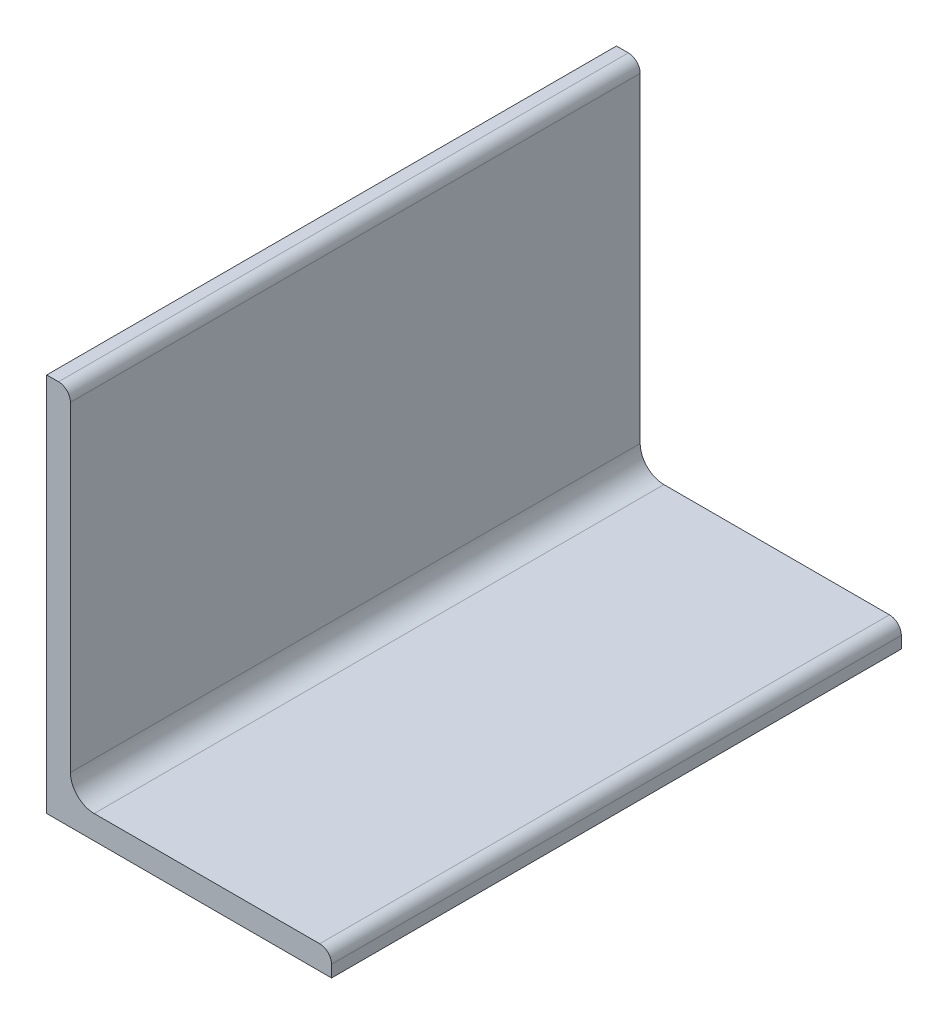
ISO-10303-21;
HEADER;
FILE_DESCRIPTION(('STEP AP214'),'2;1');
FILE_NAME('part.step','',(''),(''),'','','');
FILE_SCHEMA(('AUTOMOTIVE_DESIGN { 1 0 10303 214 1 1 1 1 }'));
ENDSEC;
DATA;
#1=APPLICATION_CONTEXT('core data for automotive mechanical design processes');
#2=APPLICATION_PROTOCOL_DEFINITION('international standard','automotive_design',2000,#1);
#3=PRODUCT_CONTEXT('',#1,'mechanical');
#4=PRODUCT('Part','Part','',(#3));
#5=PRODUCT_RELATED_PRODUCT_CATEGORY('part','',(#4));
#6=PRODUCT_DEFINITION_FORMATION('','',#4);
#7=PRODUCT_DEFINITION_CONTEXT('part definition',#1,'design');
#8=PRODUCT_DEFINITION('design','',#6,#7);
#9=PRODUCT_DEFINITION_SHAPE('','',#8);
#10=(LENGTH_UNIT() NAMED_UNIT(*) SI_UNIT(.MILLI.,.METRE.));
#11=(NAMED_UNIT(*) PLANE_ANGLE_UNIT() SI_UNIT($,.RADIAN.));
#12=(NAMED_UNIT(*) SI_UNIT($,.STERADIAN.) SOLID_ANGLE_UNIT());
#13=UNCERTAINTY_MEASURE_WITH_UNIT(LENGTH_MEASURE(1.E-05),#10,'distance_accuracy_value','');
#14=(GEOMETRIC_REPRESENTATION_CONTEXT(3) GLOBAL_UNCERTAINTY_ASSIGNED_CONTEXT((#13)) GLOBAL_UNIT_ASSIGNED_CONTEXT((#10,
#11,#12)) REPRESENTATION_CONTEXT('',''));
#15=CARTESIAN_POINT('',(0.,0.,0.));
#16=DIRECTION('',(0.,0.,1.));
#17=DIRECTION('',(1.,0.,0.));
#18=AXIS2_PLACEMENT_3D('',#15,#16,#17);
#19=CARTESIAN_POINT('',(0.425014111727251,203.678837479772,304.8));
#20=DIRECTION('',(1.,0.,0.));
#21=DIRECTION('',(0.,0.,-1.));
#22=AXIS2_PLACEMENT_3D('',#19,#20,#21);
#23=PLANE('',#22);
#24=DIRECTION('',(0.,-1.,0.));
#25=VECTOR('',#24,1.);
#26=CARTESIAN_POINT('',(0.425014111727251,203.678837479772,0.));
#27=LINE('',#26,#25);
#28=CARTESIAN_POINT('',(0.425014111727251,203.678837479772,0.));
#29=VERTEX_POINT('',#28);
#30=CARTESIAN_POINT('',(0.425014111727251,0.478837479771708,0.));
#31=VERTEX_POINT('',#30);
#32=EDGE_CURVE('E135',#29,#31,#27,.T.);
#33=ORIENTED_EDGE('',*,*,#32,.T.);
#34=DIRECTION('',(0.,0.,-1.));
#35=VECTOR('',#34,1.);
#36=CARTESIAN_POINT('',(0.425014111727251,0.478837479771708,304.8));
#37=LINE('',#36,#35);
#38=CARTESIAN_POINT('',(0.425014111727251,0.478837479771708,304.8));
#39=VERTEX_POINT('',#38);
#40=EDGE_CURVE('E11',#39,#31,#37,.T.);
#41=ORIENTED_EDGE('',*,*,#40,.F.);
#42=DIRECTION('',(0.,-1.,0.));
#43=VECTOR('',#42,1.);
#44=CARTESIAN_POINT('',(0.425014111727251,203.678837479772,304.8));
#45=LINE('',#44,#43);
#46=CARTESIAN_POINT('',(0.425014111727251,203.678837479772,304.8));
#47=VERTEX_POINT('',#46);
#48=EDGE_CURVE('E151',#47,#39,#45,.T.);
#49=ORIENTED_EDGE('',*,*,#48,.F.);
#50=DIRECTION('',(0.,0.,-1.));
#51=VECTOR('',#50,1.);
#52=CARTESIAN_POINT('',(0.425014111727251,203.678837479772,304.8));
#53=LINE('',#52,#51);
#54=EDGE_CURVE('E131',#47,#29,#53,.T.);
#55=ORIENTED_EDGE('',*,*,#54,.T.);
#56=EDGE_LOOP('',(#33,#41,#49,#55));
#57=FACE_BOUND('',#56,.T.);
#58=ADVANCED_FACE('F33',(#57),#23,.F.);
#59=CARTESIAN_POINT('',(0.425014111727251,0.478837479771708,304.8));
#60=DIRECTION('',(0.,1.,0.));
#61=DIRECTION('',(0.,0.,1.));
#62=AXIS2_PLACEMENT_3D('',#59,#60,#61);
#63=PLANE('',#62);
#64=DIRECTION('',(1.,0.,0.));
#65=VECTOR('',#64,1.);
#66=CARTESIAN_POINT('',(0.425014111727251,0.478837479771708,0.));
#67=LINE('',#66,#65);
#68=CARTESIAN_POINT('',(152.825014111727,0.478837479771708,0.));
#69=VERTEX_POINT('',#68);
#70=EDGE_CURVE('E138',#31,#69,#67,.T.);
#71=ORIENTED_EDGE('',*,*,#70,.T.);
#72=DIRECTION('',(0.,0.,-1.));
#73=VECTOR('',#72,1.);
#74=CARTESIAN_POINT('',(152.825014111727,0.478837479771708,304.8));
#75=LINE('',#74,#73);
#76=CARTESIAN_POINT('',(152.825014111727,0.478837479771708,304.8));
#77=VERTEX_POINT('',#76);
#78=EDGE_CURVE('E41',#77,#69,#75,.T.);
#79=ORIENTED_EDGE('',*,*,#78,.F.);
#80=DIRECTION('',(1.,0.,0.));
#81=VECTOR('',#80,1.);
#82=CARTESIAN_POINT('',(0.425014111727251,0.478837479771708,304.8));
#83=LINE('',#82,#81);
#84=EDGE_CURVE('E95',#39,#77,#83,.T.);
#85=ORIENTED_EDGE('',*,*,#84,.F.);
#86=ORIENTED_EDGE('',*,*,#40,.T.);
#87=EDGE_LOOP('',(#71,#79,#85,#86));
#88=FACE_BOUND('',#87,.T.);
#89=ADVANCED_FACE('F194',(#88),#63,.F.);
#90=CARTESIAN_POINT('',(152.825014111727,0.478837479771708,304.8));
#91=DIRECTION('',(-1.,0.,0.));
#92=DIRECTION('',(0.,0.,1.));
#93=AXIS2_PLACEMENT_3D('',#90,#91,#92);
#94=PLANE('',#93);
#95=DIRECTION('',(0.,1.,0.));
#96=VECTOR('',#95,1.);
#97=CARTESIAN_POINT('',(152.825014111727,0.478837479771708,0.));
#98=LINE('',#97,#96);
#99=CARTESIAN_POINT('',(152.825014111727,6.82883747977171,0.));
#100=VERTEX_POINT('',#99);
#101=EDGE_CURVE('E140',#69,#100,#98,.T.);
#102=ORIENTED_EDGE('',*,*,#101,.T.);
#103=DIRECTION('',(0.,0.,-1.));
#104=VECTOR('',#103,1.);
#105=CARTESIAN_POINT('',(152.825014111727,6.82883747977171,304.8));
#106=LINE('',#105,#104);
#107=CARTESIAN_POINT('',(152.825014111727,6.82883747977171,304.8));
#108=VERTEX_POINT('',#107);
#109=EDGE_CURVE('E161',#108,#100,#106,.T.);
#110=ORIENTED_EDGE('',*,*,#109,.F.);
#111=DIRECTION('',(0.,1.,0.));
#112=VECTOR('',#111,1.);
#113=CARTESIAN_POINT('',(152.825014111727,0.478837479771708,304.8));
#114=LINE('',#113,#112);
#115=EDGE_CURVE('E169',#77,#108,#114,.T.);
#116=ORIENTED_EDGE('',*,*,#115,.F.);
#117=ORIENTED_EDGE('',*,*,#78,.T.);
#118=EDGE_LOOP('',(#102,#110,#116,#117));
#119=FACE_BOUND('',#118,.T.);
#120=ADVANCED_FACE('F167',(#119),#94,.F.);
#121=CARTESIAN_POINT('',(146.475014111727,6.82883747977171,304.8));
#122=DIRECTION('',(0.,0.,-1.));
#123=DIRECTION('',(-1.,0.,0.));
#124=AXIS2_PLACEMENT_3D('',#121,#122,#123);
#125=CYLINDRICAL_SURFACE('',#124,6.35);
#126=CARTESIAN_POINT('',(146.475014111727,6.82883747977171,0.));
#127=DIRECTION('',(0.,0.,1.));
#128=DIRECTION('',(1.,0.,0.));
#129=AXIS2_PLACEMENT_3D('',#126,#127,#128);
#130=CIRCLE('',#129,6.35);
#131=CARTESIAN_POINT('',(146.475014111727,13.1788374797717,0.));
#132=VERTEX_POINT('',#131);
#133=EDGE_CURVE('E142',#100,#132,#130,.T.);
#134=ORIENTED_EDGE('',*,*,#133,.T.);
#135=DIRECTION('',(0.,0.,-1.));
#136=VECTOR('',#135,1.);
#137=CARTESIAN_POINT('',(146.475014111727,13.1788374797717,304.8));
#138=LINE('',#137,#136);
#139=CARTESIAN_POINT('',(146.475014111727,13.1788374797717,304.8));
#140=VERTEX_POINT('',#139);
#141=EDGE_CURVE('E158',#140,#132,#138,.T.);
#142=ORIENTED_EDGE('',*,*,#141,.F.);
#143=CARTESIAN_POINT('',(146.475014111727,6.82883747977171,304.8));
#144=DIRECTION('',(0.,0.,1.));
#145=DIRECTION('',(1.,0.,0.));
#146=AXIS2_PLACEMENT_3D('',#143,#144,#145);
#147=CIRCLE('',#146,6.35);
#148=EDGE_CURVE('E185',#108,#140,#147,.T.);
#149=ORIENTED_EDGE('',*,*,#148,.F.);
#150=ORIENTED_EDGE('',*,*,#109,.T.);
#151=EDGE_LOOP('',(#134,#142,#149,#150));
#152=FACE_BOUND('',#151,.T.);
#153=ADVANCED_FACE('F178',(#152),#125,.T.);
#154=CARTESIAN_POINT('',(146.475014111727,13.1788374797717,304.8));
#155=DIRECTION('',(0.,-1.,0.));
#156=DIRECTION('',(0.,0.,-1.));
#157=AXIS2_PLACEMENT_3D('',#154,#155,#156);
#158=PLANE('',#157);
#159=DIRECTION('',(-1.,0.,0.));
#160=VECTOR('',#159,1.);
#161=CARTESIAN_POINT('',(146.475014111727,13.1788374797717,0.));
#162=LINE('',#161,#160);
#163=CARTESIAN_POINT('',(25.8250141117272,13.1788374797717,0.));
#164=VERTEX_POINT('',#163);
#165=EDGE_CURVE('E144',#132,#164,#162,.T.);
#166=ORIENTED_EDGE('',*,*,#165,.T.);
#167=DIRECTION('',(0.,0.,-1.));
#168=VECTOR('',#167,1.);
#169=CARTESIAN_POINT('',(25.8250141117272,13.1788374797717,304.8));
#170=LINE('',#169,#168);
#171=CARTESIAN_POINT('',(25.8250141117272,13.1788374797717,304.8));
#172=VERTEX_POINT('',#171);
#173=EDGE_CURVE('E155',#172,#164,#170,.T.);
#174=ORIENTED_EDGE('',*,*,#173,.F.);
#175=DIRECTION('',(-1.,0.,0.));
#176=VECTOR('',#175,1.);
#177=CARTESIAN_POINT('',(146.475014111727,13.1788374797717,304.8));
#178=LINE('',#177,#176);
#179=EDGE_CURVE('E184',#140,#172,#178,.T.);
#180=ORIENTED_EDGE('',*,*,#179,.F.);
#181=ORIENTED_EDGE('',*,*,#141,.T.);
#182=EDGE_LOOP('',(#166,#174,#180,#181));
#183=FACE_BOUND('',#182,.T.);
#184=ADVANCED_FACE('F182',(#183),#158,.F.);
#185=CARTESIAN_POINT('',(25.8250141117272,25.8788374797717,304.8));
#186=DIRECTION('',(0.,0.,-1.));
#187=DIRECTION('',(-1.,0.,0.));
#188=AXIS2_PLACEMENT_3D('',#185,#186,#187);
#189=CYLINDRICAL_SURFACE('',#188,12.7);
#190=CARTESIAN_POINT('',(25.8250141117272,25.8788374797717,0.));
#191=DIRECTION('',(0.,0.,-1.));
#192=DIRECTION('',(1.,0.,0.));
#193=AXIS2_PLACEMENT_3D('',#190,#191,#192);
#194=CIRCLE('',#193,12.7);
#195=CARTESIAN_POINT('',(13.1250141117272,25.8788374797717,0.));
#196=VERTEX_POINT('',#195);
#197=EDGE_CURVE('E146',#164,#196,#194,.T.);
#198=ORIENTED_EDGE('',*,*,#197,.T.);
#199=DIRECTION('',(0.,0.,-1.));
#200=VECTOR('',#199,1.);
#201=CARTESIAN_POINT('',(13.1250141117272,25.8788374797717,304.8));
#202=LINE('',#201,#200);
#203=CARTESIAN_POINT('',(13.1250141117272,25.8788374797717,304.8));
#204=VERTEX_POINT('',#203);
#205=EDGE_CURVE('E126',#204,#196,#202,.T.);
#206=ORIENTED_EDGE('',*,*,#205,.F.);
#207=CARTESIAN_POINT('',(25.8250141117272,25.8788374797717,304.8));
#208=DIRECTION('',(0.,0.,-1.));
#209=DIRECTION('',(1.,0.,0.));
#210=AXIS2_PLACEMENT_3D('',#207,#208,#209);
#211=CIRCLE('',#210,12.7);
#212=EDGE_CURVE('E117',#172,#204,#211,.T.);
#213=ORIENTED_EDGE('',*,*,#212,.F.);
#214=ORIENTED_EDGE('',*,*,#173,.T.);
#215=EDGE_LOOP('',(#198,#206,#213,#214));
#216=FACE_BOUND('',#215,.T.);
#217=ADVANCED_FACE('F206',(#216),#189,.F.);
#218=CARTESIAN_POINT('',(13.1250141117273,25.8788374797717,304.8));
#219=DIRECTION('',(-1.,0.,0.));
#220=DIRECTION('',(0.,0.,1.));
#221=AXIS2_PLACEMENT_3D('',#218,#219,#220);
#222=PLANE('',#221);
#223=DIRECTION('',(0.,1.,0.));
#224=VECTOR('',#223,1.);
#225=CARTESIAN_POINT('',(13.1250141117273,25.8788374797717,0.));
#226=LINE('',#225,#224);
#227=CARTESIAN_POINT('',(13.1250141117273,197.328837479772,0.));
#228=VERTEX_POINT('',#227);
#229=EDGE_CURVE('E125',#196,#228,#226,.T.);
#230=ORIENTED_EDGE('',*,*,#229,.T.);
#231=DIRECTION('',(0.,0.,-1.));
#232=VECTOR('',#231,1.);
#233=CARTESIAN_POINT('',(13.1250141117273,197.328837479772,304.8));
#234=LINE('',#233,#232);
#235=CARTESIAN_POINT('',(13.1250141117273,197.328837479772,304.8));
#236=VERTEX_POINT('',#235);
#237=EDGE_CURVE('E122',#236,#228,#234,.T.);
#238=ORIENTED_EDGE('',*,*,#237,.F.);
#239=DIRECTION('',(0.,1.,0.));
#240=VECTOR('',#239,1.);
#241=CARTESIAN_POINT('',(13.1250141117273,25.8788374797717,304.8));
#242=LINE('',#241,#240);
#243=EDGE_CURVE('E111',#204,#236,#242,.T.);
#244=ORIENTED_EDGE('',*,*,#243,.F.);
#245=ORIENTED_EDGE('',*,*,#205,.T.);
#246=EDGE_LOOP('',(#230,#238,#244,#245));
#247=FACE_BOUND('',#246,.T.);
#248=ADVANCED_FACE('F123',(#247),#222,.F.);
#249=CARTESIAN_POINT('',(6.77501411172725,197.328837479772,304.8));
#250=DIRECTION('',(0.,0.,-1.));
#251=DIRECTION('',(-1.,0.,0.));
#252=AXIS2_PLACEMENT_3D('',#249,#250,#251);
#253=CYLINDRICAL_SURFACE('',#252,6.35);
#254=CARTESIAN_POINT('',(6.77501411172725,197.328837479772,0.));
#255=DIRECTION('',(0.,0.,1.));
#256=DIRECTION('',(1.,0.,0.));
#257=AXIS2_PLACEMENT_3D('',#254,#255,#256);
#258=CIRCLE('',#257,6.35);
#259=CARTESIAN_POINT('',(6.77501411172725,203.678837479772,0.));
#260=VERTEX_POINT('',#259);
#261=EDGE_CURVE('E81',#228,#260,#258,.T.);
#262=ORIENTED_EDGE('',*,*,#261,.T.);
#263=DIRECTION('',(0.,0.,-1.));
#264=VECTOR('',#263,1.);
#265=CARTESIAN_POINT('',(6.77501411172725,203.678837479772,304.8));
#266=LINE('',#265,#264);
#267=CARTESIAN_POINT('',(6.77501411172725,203.678837479772,304.8));
#268=VERTEX_POINT('',#267);
#269=EDGE_CURVE('E127',#268,#260,#266,.T.);
#270=ORIENTED_EDGE('',*,*,#269,.F.);
#271=CARTESIAN_POINT('',(6.77501411172725,197.328837479772,304.8));
#272=DIRECTION('',(0.,0.,1.));
#273=DIRECTION('',(1.,0.,0.));
#274=AXIS2_PLACEMENT_3D('',#271,#272,#273);
#275=CIRCLE('',#274,6.35);
#276=EDGE_CURVE('E115',#236,#268,#275,.T.);
#277=ORIENTED_EDGE('',*,*,#276,.F.);
#278=ORIENTED_EDGE('',*,*,#237,.T.);
#279=EDGE_LOOP('',(#262,#270,#277,#278));
#280=FACE_BOUND('',#279,.T.);
#281=ADVANCED_FACE('F129',(#280),#253,.T.);
#282=CARTESIAN_POINT('',(6.77501411172725,203.678837479772,304.8));
#283=DIRECTION('',(0.,-1.,0.));
#284=DIRECTION('',(0.,0.,-1.));
#285=AXIS2_PLACEMENT_3D('',#282,#283,#284);
#286=PLANE('',#285);
#287=DIRECTION('',(-1.,0.,0.));
#288=VECTOR('',#287,1.);
#289=CARTESIAN_POINT('',(6.77501411172725,203.678837479772,0.));
#290=LINE('',#289,#288);
#291=EDGE_CURVE('E87',#260,#29,#290,.T.);
#292=ORIENTED_EDGE('',*,*,#291,.T.);
#293=ORIENTED_EDGE('',*,*,#54,.F.);
#294=DIRECTION('',(-1.,0.,0.));
#295=VECTOR('',#294,1.);
#296=CARTESIAN_POINT('',(6.77501411172725,203.678837479772,304.8));
#297=LINE('',#296,#295);
#298=EDGE_CURVE('E49',#268,#47,#297,.T.);
#299=ORIENTED_EDGE('',*,*,#298,.F.);
#300=ORIENTED_EDGE('',*,*,#269,.T.);
#301=EDGE_LOOP('',(#292,#293,#299,#300));
#302=FACE_BOUND('',#301,.T.);
#303=ADVANCED_FACE('F214',(#302),#286,.F.);
#304=CARTESIAN_POINT('',(146.475014111727,6.82883747977171,304.8));
#305=DIRECTION('',(0.,0.,1.));
#306=DIRECTION('',(1.,0.,0.));
#307=AXIS2_PLACEMENT_3D('',#304,#305,#306);
#308=PLANE('',#307);
#309=ORIENTED_EDGE('',*,*,#48,.T.);
#310=ORIENTED_EDGE('',*,*,#84,.T.);
#311=ORIENTED_EDGE('',*,*,#115,.T.);
#312=ORIENTED_EDGE('',*,*,#148,.T.);
#313=ORIENTED_EDGE('',*,*,#179,.T.);
#314=ORIENTED_EDGE('',*,*,#212,.T.);
#315=ORIENTED_EDGE('',*,*,#243,.T.);
#316=ORIENTED_EDGE('',*,*,#276,.T.);
#317=ORIENTED_EDGE('',*,*,#298,.T.);
#318=EDGE_LOOP('',(#309,#310,#311,#312,#313,#314,#315,#316,#317));
#319=FACE_BOUND('',#318,.T.);
#320=ADVANCED_FACE('F113',(#319),#308,.T.);
#321=CARTESIAN_POINT('',(146.475014111727,6.82883747977171,0.));
#322=DIRECTION('',(0.,0.,1.));
#323=DIRECTION('',(1.,0.,0.));
#324=AXIS2_PLACEMENT_3D('',#321,#322,#323);
#325=PLANE('',#324);
#326=ORIENTED_EDGE('',*,*,#32,.F.);
#327=ORIENTED_EDGE('',*,*,#291,.F.);
#328=ORIENTED_EDGE('',*,*,#261,.F.);
#329=ORIENTED_EDGE('',*,*,#229,.F.);
#330=ORIENTED_EDGE('',*,*,#197,.F.);
#331=ORIENTED_EDGE('',*,*,#165,.F.);
#332=ORIENTED_EDGE('',*,*,#133,.F.);
#333=ORIENTED_EDGE('',*,*,#101,.F.);
#334=ORIENTED_EDGE('',*,*,#70,.F.);
#335=EDGE_LOOP('',(#326,#327,#328,#329,#330,#331,#332,#333,#334));
#336=FACE_BOUND('',#335,.T.);
#337=ADVANCED_FACE('F173',(#336),#325,.F.);
#338=CLOSED_SHELL('',(#58,#89,#120,#153,#184,#217,#248,#281,#303,#320,#337));
#339=MANIFOLD_SOLID_BREP('B2',#338);
#340=ADVANCED_BREP_SHAPE_REPRESENTATION('',(#18,#339),#14);
#341=SHAPE_DEFINITION_REPRESENTATION(#9,#340);
ENDSEC;
END-ISO-10303-21;
